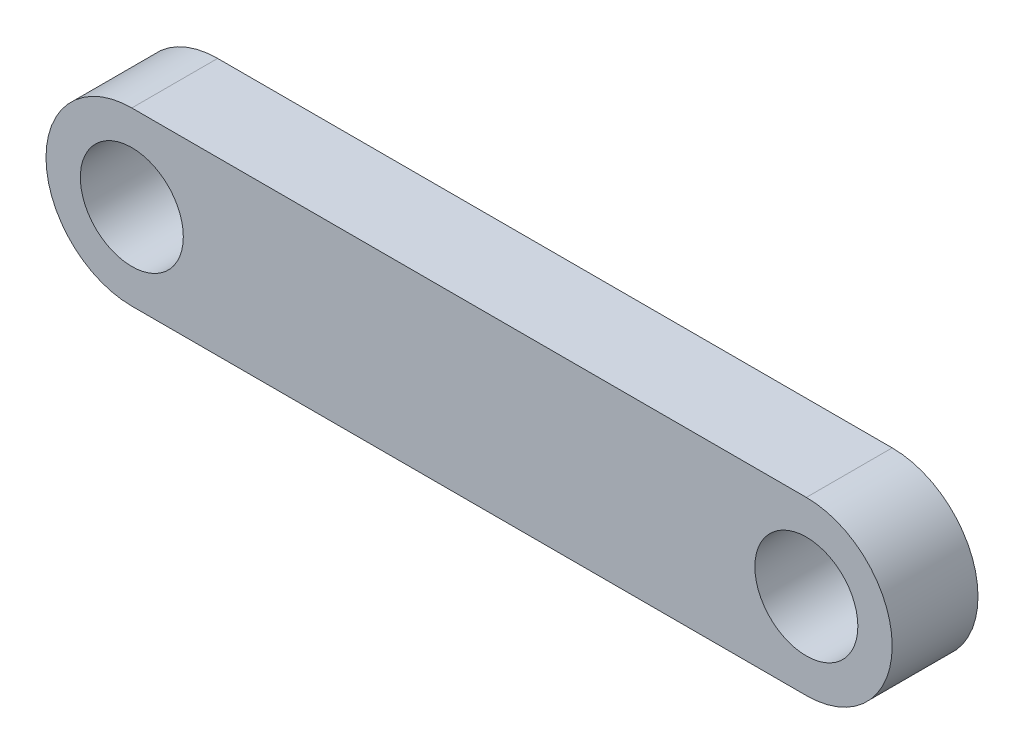
ISO-10303-21;
HEADER;
FILE_DESCRIPTION(('STEP AP214'),'2;1');
FILE_NAME('part.step','',(''),(''),'','','');
FILE_SCHEMA(('AUTOMOTIVE_DESIGN { 1 0 10303 214 1 1 1 1 }'));
ENDSEC;
DATA;
#1=APPLICATION_CONTEXT('core data for automotive mechanical design processes');
#2=APPLICATION_PROTOCOL_DEFINITION('international standard','automotive_design',2000,#1);
#3=PRODUCT_CONTEXT('',#1,'mechanical');
#4=PRODUCT('Part','Part','',(#3));
#5=PRODUCT_RELATED_PRODUCT_CATEGORY('part','',(#4));
#6=PRODUCT_DEFINITION_FORMATION('','',#4);
#7=PRODUCT_DEFINITION_CONTEXT('part definition',#1,'design');
#8=PRODUCT_DEFINITION('design','',#6,#7);
#9=PRODUCT_DEFINITION_SHAPE('','',#8);
#10=(LENGTH_UNIT() NAMED_UNIT(*) SI_UNIT(.MILLI.,.METRE.));
#11=(NAMED_UNIT(*) PLANE_ANGLE_UNIT() SI_UNIT($,.RADIAN.));
#12=(NAMED_UNIT(*) SI_UNIT($,.STERADIAN.) SOLID_ANGLE_UNIT());
#13=UNCERTAINTY_MEASURE_WITH_UNIT(LENGTH_MEASURE(1.E-05),#10,'distance_accuracy_value','');
#14=(GEOMETRIC_REPRESENTATION_CONTEXT(3) GLOBAL_UNCERTAINTY_ASSIGNED_CONTEXT((#13)) GLOBAL_UNIT_ASSIGNED_CONTEXT((#10,
#11,#12)) REPRESENTATION_CONTEXT('',''));
#15=CARTESIAN_POINT('',(0.,0.,0.));
#16=DIRECTION('',(0.,0.,1.));
#17=DIRECTION('',(1.,0.,0.));
#18=AXIS2_PLACEMENT_3D('',#15,#16,#17);
#19=CARTESIAN_POINT('',(19.65,0.,5.));
#20=DIRECTION('',(0.,0.,1.));
#21=DIRECTION('',(1.,0.,0.));
#22=AXIS2_PLACEMENT_3D('',#19,#20,#21);
#23=PLANE('',#22);
#24=CARTESIAN_POINT('',(19.65,0.,5.));
#25=DIRECTION('',(0.,0.,1.));
#26=DIRECTION('',(1.,0.,0.));
#27=AXIS2_PLACEMENT_3D('',#24,#25,#26);
#28=CIRCLE('',#27,3.);
#29=CARTESIAN_POINT('',(22.65,0.,5.));
#30=VERTEX_POINT('',#29);
#31=EDGE_CURVE('E115',#30,#30,#28,.T.);
#32=ORIENTED_EDGE('',*,*,#31,.F.);
#33=EDGE_LOOP('',(#32));
#34=FACE_BOUND('',#33,.T.);
#35=CARTESIAN_POINT('',(19.65,0.,5.));
#36=DIRECTION('',(0.,0.,1.));
#37=DIRECTION('',(1.,0.,0.));
#38=AXIS2_PLACEMENT_3D('',#35,#36,#37);
#39=CIRCLE('',#38,5.);
#40=CARTESIAN_POINT('',(19.65,-4.99999999999999,5.));
#41=VERTEX_POINT('',#40);
#42=CARTESIAN_POINT('',(19.65,5.00000000000001,5.));
#43=VERTEX_POINT('',#42);
#44=EDGE_CURVE('E85',#41,#43,#39,.T.);
#45=ORIENTED_EDGE('',*,*,#44,.T.);
#46=DIRECTION('',(-1.,0.,0.));
#47=VECTOR('',#46,1.);
#48=CARTESIAN_POINT('',(19.65,5.00000000000001,5.));
#49=LINE('',#48,#47);
#50=CARTESIAN_POINT('',(-19.65,5.,5.));
#51=VERTEX_POINT('',#50);
#52=EDGE_CURVE('E80',#43,#51,#49,.T.);
#53=ORIENTED_EDGE('',*,*,#52,.T.);
#54=CARTESIAN_POINT('',(-19.65,0.,5.));
#55=DIRECTION('',(0.,0.,1.));
#56=DIRECTION('',(1.,0.,0.));
#57=AXIS2_PLACEMENT_3D('',#54,#55,#56);
#58=CIRCLE('',#57,5.);
#59=CARTESIAN_POINT('',(-19.65,-5.00000000000001,5.));
#60=VERTEX_POINT('',#59);
#61=EDGE_CURVE('E83',#51,#60,#58,.T.);
#62=ORIENTED_EDGE('',*,*,#61,.T.);
#63=DIRECTION('',(1.,0.,0.));
#64=VECTOR('',#63,1.);
#65=CARTESIAN_POINT('',(19.65,-4.99999999999999,5.));
#66=LINE('',#65,#64);
#67=EDGE_CURVE('E50',#60,#41,#66,.T.);
#68=ORIENTED_EDGE('',*,*,#67,.T.);
#69=EDGE_LOOP('',(#45,#53,#62,#68));
#70=FACE_BOUND('',#69,.T.);
#71=CARTESIAN_POINT('',(-19.65,0.,5.));
#72=DIRECTION('',(0.,0.,1.));
#73=DIRECTION('',(1.,0.,0.));
#74=AXIS2_PLACEMENT_3D('',#71,#72,#73);
#75=CIRCLE('',#74,3.);
#76=CARTESIAN_POINT('',(-16.65,0.,5.));
#77=VERTEX_POINT('',#76);
#78=EDGE_CURVE('E100',#77,#77,#75,.T.);
#79=ORIENTED_EDGE('',*,*,#78,.F.);
#80=EDGE_LOOP('',(#79));
#81=FACE_BOUND('',#80,.T.);
#82=ADVANCED_FACE('F33',(#34,#70,#81),#23,.T.);
#83=CARTESIAN_POINT('',(19.65,0.,0.));
#84=DIRECTION('',(0.,0.,1.));
#85=DIRECTION('',(1.,0.,0.));
#86=AXIS2_PLACEMENT_3D('',#83,#84,#85);
#87=PLANE('',#86);
#88=CARTESIAN_POINT('',(19.65,0.,0.));
#89=DIRECTION('',(0.,0.,-1.));
#90=DIRECTION('',(-1.,0.,0.));
#91=AXIS2_PLACEMENT_3D('',#88,#89,#90);
#92=CIRCLE('',#91,3.);
#93=CARTESIAN_POINT('',(16.65,0.,0.));
#94=VERTEX_POINT('',#93);
#95=EDGE_CURVE('E120',#94,#94,#92,.T.);
#96=ORIENTED_EDGE('',*,*,#95,.F.);
#97=EDGE_LOOP('',(#96));
#98=FACE_BOUND('',#97,.T.);
#99=CARTESIAN_POINT('',(19.65,0.,0.));
#100=DIRECTION('',(0.,0.,1.));
#101=DIRECTION('',(1.,0.,0.));
#102=AXIS2_PLACEMENT_3D('',#99,#100,#101);
#103=CIRCLE('',#102,5.);
#104=CARTESIAN_POINT('',(19.65,-4.99999999999999,0.));
#105=VERTEX_POINT('',#104);
#106=CARTESIAN_POINT('',(19.65,5.00000000000001,0.));
#107=VERTEX_POINT('',#106);
#108=EDGE_CURVE('E97',#105,#107,#103,.T.);
#109=ORIENTED_EDGE('',*,*,#108,.F.);
#110=DIRECTION('',(1.,0.,0.));
#111=VECTOR('',#110,1.);
#112=CARTESIAN_POINT('',(19.65,-4.99999999999999,0.));
#113=LINE('',#112,#111);
#114=CARTESIAN_POINT('',(-19.65,-5.00000000000001,0.));
#115=VERTEX_POINT('',#114);
#116=EDGE_CURVE('E73',#115,#105,#113,.T.);
#117=ORIENTED_EDGE('',*,*,#116,.F.);
#118=CARTESIAN_POINT('',(-19.65,0.,0.));
#119=DIRECTION('',(0.,0.,1.));
#120=DIRECTION('',(1.,0.,0.));
#121=AXIS2_PLACEMENT_3D('',#118,#119,#120);
#122=CIRCLE('',#121,5.);
#123=CARTESIAN_POINT('',(-19.65,5.,0.));
#124=VERTEX_POINT('',#123);
#125=EDGE_CURVE('E67',#124,#115,#122,.T.);
#126=ORIENTED_EDGE('',*,*,#125,.F.);
#127=DIRECTION('',(-1.,0.,0.));
#128=VECTOR('',#127,1.);
#129=CARTESIAN_POINT('',(19.65,5.00000000000001,0.));
#130=LINE('',#129,#128);
#131=EDGE_CURVE('E89',#107,#124,#130,.T.);
#132=ORIENTED_EDGE('',*,*,#131,.F.);
#133=EDGE_LOOP('',(#109,#117,#126,#132));
#134=FACE_BOUND('',#133,.T.);
#135=CARTESIAN_POINT('',(-19.65,0.,0.));
#136=DIRECTION('',(0.,0.,1.));
#137=DIRECTION('',(1.,0.,0.));
#138=AXIS2_PLACEMENT_3D('',#135,#136,#137);
#139=CIRCLE('',#138,3.);
#140=CARTESIAN_POINT('',(-16.65,0.,0.));
#141=VERTEX_POINT('',#140);
#142=EDGE_CURVE('E112',#141,#141,#139,.T.);
#143=ORIENTED_EDGE('',*,*,#142,.T.);
#144=EDGE_LOOP('',(#143));
#145=FACE_BOUND('',#144,.T.);
#146=ADVANCED_FACE('F108',(#98,#134,#145),#87,.F.);
#147=CARTESIAN_POINT('',(19.65,0.,5.));
#148=DIRECTION('',(0.,0.,-1.));
#149=DIRECTION('',(-1.,0.,0.));
#150=AXIS2_PLACEMENT_3D('',#147,#148,#149);
#151=CYLINDRICAL_SURFACE('',#150,5.);
#152=ORIENTED_EDGE('',*,*,#108,.T.);
#153=DIRECTION('',(0.,0.,-1.));
#154=VECTOR('',#153,1.);
#155=CARTESIAN_POINT('',(19.65,5.00000000000001,5.));
#156=LINE('',#155,#154);
#157=EDGE_CURVE('E11',#43,#107,#156,.T.);
#158=ORIENTED_EDGE('',*,*,#157,.F.);
#159=ORIENTED_EDGE('',*,*,#44,.F.);
#160=DIRECTION('',(0.,0.,-1.));
#161=VECTOR('',#160,1.);
#162=CARTESIAN_POINT('',(19.65,-4.99999999999999,5.));
#163=LINE('',#162,#161);
#164=EDGE_CURVE('E93',#41,#105,#163,.T.);
#165=ORIENTED_EDGE('',*,*,#164,.T.);
#166=EDGE_LOOP('',(#152,#158,#159,#165));
#167=FACE_BOUND('',#166,.T.);
#168=ADVANCED_FACE('F35',(#167),#151,.T.);
#169=CARTESIAN_POINT('',(19.65,5.00000000000001,5.));
#170=DIRECTION('',(0.,-1.,0.));
#171=DIRECTION('',(1.,0.,0.));
#172=AXIS2_PLACEMENT_3D('',#169,#170,#171);
#173=PLANE('',#172);
#174=ORIENTED_EDGE('',*,*,#131,.T.);
#175=DIRECTION('',(0.,0.,-1.));
#176=VECTOR('',#175,1.);
#177=CARTESIAN_POINT('',(-19.65,5.,5.));
#178=LINE('',#177,#176);
#179=EDGE_CURVE('E42',#51,#124,#178,.T.);
#180=ORIENTED_EDGE('',*,*,#179,.F.);
#181=ORIENTED_EDGE('',*,*,#52,.F.);
#182=ORIENTED_EDGE('',*,*,#157,.T.);
#183=EDGE_LOOP('',(#174,#180,#181,#182));
#184=FACE_BOUND('',#183,.T.);
#185=ADVANCED_FACE('F88',(#184),#173,.F.);
#186=CARTESIAN_POINT('',(-19.65,0.,5.));
#187=DIRECTION('',(0.,0.,-1.));
#188=DIRECTION('',(-1.,0.,0.));
#189=AXIS2_PLACEMENT_3D('',#186,#187,#188);
#190=CYLINDRICAL_SURFACE('',#189,5.);
#191=ORIENTED_EDGE('',*,*,#125,.T.);
#192=DIRECTION('',(0.,0.,-1.));
#193=VECTOR('',#192,1.);
#194=CARTESIAN_POINT('',(-19.65,-5.00000000000001,5.));
#195=LINE('',#194,#193);
#196=EDGE_CURVE('E90',#60,#115,#195,.T.);
#197=ORIENTED_EDGE('',*,*,#196,.F.);
#198=ORIENTED_EDGE('',*,*,#61,.F.);
#199=ORIENTED_EDGE('',*,*,#179,.T.);
#200=EDGE_LOOP('',(#191,#197,#198,#199));
#201=FACE_BOUND('',#200,.T.);
#202=ADVANCED_FACE('F91',(#201),#190,.T.);
#203=CARTESIAN_POINT('',(19.65,-4.99999999999999,5.));
#204=DIRECTION('',(0.,1.,0.));
#205=DIRECTION('',(-1.,0.,0.));
#206=AXIS2_PLACEMENT_3D('',#203,#204,#205);
#207=PLANE('',#206);
#208=ORIENTED_EDGE('',*,*,#116,.T.);
#209=ORIENTED_EDGE('',*,*,#164,.F.);
#210=ORIENTED_EDGE('',*,*,#67,.F.);
#211=ORIENTED_EDGE('',*,*,#196,.T.);
#212=EDGE_LOOP('',(#208,#209,#210,#211));
#213=FACE_BOUND('',#212,.T.);
#214=ADVANCED_FACE('F105',(#213),#207,.F.);
#215=CARTESIAN_POINT('',(-19.65,0.,5.));
#216=DIRECTION('',(0.,0.,-1.));
#217=DIRECTION('',(-1.,0.,0.));
#218=AXIS2_PLACEMENT_3D('',#215,#216,#217);
#219=CYLINDRICAL_SURFACE('',#218,3.);
#220=ORIENTED_EDGE('',*,*,#78,.T.);
#221=EDGE_LOOP('',(#220));
#222=FACE_BOUND('',#221,.T.);
#223=ORIENTED_EDGE('',*,*,#142,.F.);
#224=EDGE_LOOP('',(#223));
#225=FACE_BOUND('',#224,.T.);
#226=ADVANCED_FACE('F138',(#222,#225),#219,.F.);
#227=CARTESIAN_POINT('',(19.65,0.,15.));
#228=DIRECTION('',(0.,0.,-1.));
#229=DIRECTION('',(-1.,0.,0.));
#230=AXIS2_PLACEMENT_3D('',#227,#228,#229);
#231=CYLINDRICAL_SURFACE('',#230,3.);
#232=ORIENTED_EDGE('',*,*,#31,.T.);
#233=EDGE_LOOP('',(#232));
#234=FACE_BOUND('',#233,.T.);
#235=ORIENTED_EDGE('',*,*,#95,.T.);
#236=EDGE_LOOP('',(#235));
#237=FACE_BOUND('',#236,.T.);
#238=ADVANCED_FACE('F124',(#234,#237),#231,.F.);
#239=CLOSED_SHELL('',(#82,#146,#168,#185,#202,#214,#226,#238));
#240=MANIFOLD_SOLID_BREP('B2',#239);
#241=ADVANCED_BREP_SHAPE_REPRESENTATION('',(#18,#240),#14);
#242=SHAPE_DEFINITION_REPRESENTATION(#9,#241);
ENDSEC;
END-ISO-10303-21;
